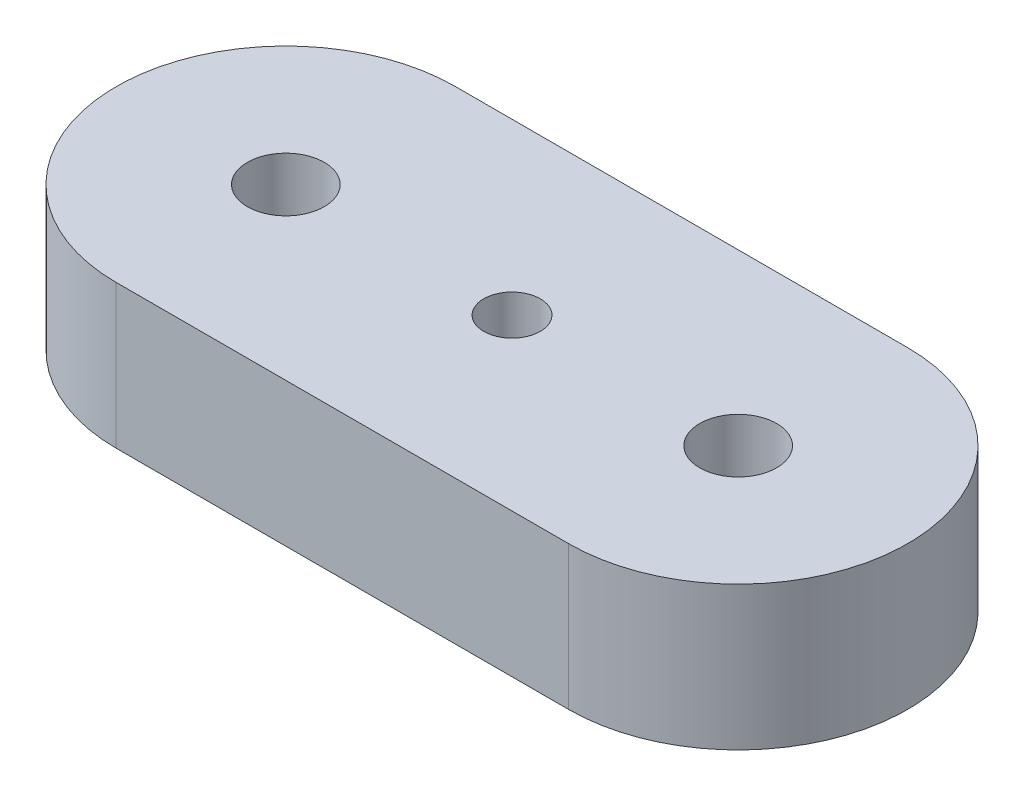
ISO-10303-21;
HEADER;
FILE_DESCRIPTION(('STEP AP214'),'2;1');
FILE_NAME('part.step','',(''),(''),'','','');
FILE_SCHEMA(('AUTOMOTIVE_DESIGN { 1 0 10303 214 1 1 1 1 }'));
ENDSEC;
DATA;
#1=APPLICATION_CONTEXT('core data for automotive mechanical design processes');
#2=APPLICATION_PROTOCOL_DEFINITION('international standard','automotive_design',2000,#1);
#3=PRODUCT_CONTEXT('',#1,'mechanical');
#4=PRODUCT('Part','Part','',(#3));
#5=PRODUCT_RELATED_PRODUCT_CATEGORY('part','',(#4));
#6=PRODUCT_DEFINITION_FORMATION('','',#4);
#7=PRODUCT_DEFINITION_CONTEXT('part definition',#1,'design');
#8=PRODUCT_DEFINITION('design','',#6,#7);
#9=PRODUCT_DEFINITION_SHAPE('','',#8);
#10=(LENGTH_UNIT() NAMED_UNIT(*) SI_UNIT(.MILLI.,.METRE.));
#11=(NAMED_UNIT(*) PLANE_ANGLE_UNIT() SI_UNIT($,.RADIAN.));
#12=(NAMED_UNIT(*) SI_UNIT($,.STERADIAN.) SOLID_ANGLE_UNIT());
#13=UNCERTAINTY_MEASURE_WITH_UNIT(LENGTH_MEASURE(1.E-05),#10,'distance_accuracy_value','');
#14=(GEOMETRIC_REPRESENTATION_CONTEXT(3) GLOBAL_UNCERTAINTY_ASSIGNED_CONTEXT((#13)) GLOBAL_UNIT_ASSIGNED_CONTEXT((#10,
#11,#12)) REPRESENTATION_CONTEXT('',''));
#15=CARTESIAN_POINT('',(0.,0.,0.));
#16=DIRECTION('',(0.,0.,1.));
#17=DIRECTION('',(1.,0.,0.));
#18=AXIS2_PLACEMENT_3D('',#15,#16,#17);
#19=CARTESIAN_POINT('',(0.,6.35,-7.5));
#20=DIRECTION('',(0.,-1.,0.));
#21=DIRECTION('',(0.,0.,-1.));
#22=AXIS2_PLACEMENT_3D('',#19,#20,#21);
#23=CYLINDRICAL_SURFACE('',#22,7.5);
#24=CARTESIAN_POINT('',(0.,0.,-7.5));
#25=DIRECTION('',(0.,1.,0.));
#26=DIRECTION('',(0.,0.,1.));
#27=AXIS2_PLACEMENT_3D('',#24,#25,#26);
#28=CIRCLE('',#27,7.5);
#29=CARTESIAN_POINT('',(0.,0.,-15.));
#30=VERTEX_POINT('',#29);
#31=CARTESIAN_POINT('',(0.,0.,0.));
#32=VERTEX_POINT('',#31);
#33=EDGE_CURVE('E96',#30,#32,#28,.T.);
#34=ORIENTED_EDGE('',*,*,#33,.T.);
#35=DIRECTION('',(0.,-1.,0.));
#36=VECTOR('',#35,1.);
#37=CARTESIAN_POINT('',(0.,6.35,0.));
#38=LINE('',#37,#36);
#39=CARTESIAN_POINT('',(0.,6.35,0.));
#40=VERTEX_POINT('',#39);
#41=EDGE_CURVE('E11',#40,#32,#38,.T.);
#42=ORIENTED_EDGE('',*,*,#41,.F.);
#43=CARTESIAN_POINT('',(0.,6.35,-7.5));
#44=DIRECTION('',(0.,1.,0.));
#45=DIRECTION('',(0.,0.,1.));
#46=AXIS2_PLACEMENT_3D('',#43,#44,#45);
#47=CIRCLE('',#46,7.5);
#48=CARTESIAN_POINT('',(0.,6.35,-15.));
#49=VERTEX_POINT('',#48);
#50=EDGE_CURVE('E84',#49,#40,#47,.T.);
#51=ORIENTED_EDGE('',*,*,#50,.F.);
#52=DIRECTION('',(0.,-1.,0.));
#53=VECTOR('',#52,1.);
#54=CARTESIAN_POINT('',(0.,6.35,-15.));
#55=LINE('',#54,#53);
#56=EDGE_CURVE('E92',#49,#30,#55,.T.);
#57=ORIENTED_EDGE('',*,*,#56,.T.);
#58=EDGE_LOOP('',(#34,#42,#51,#57));
#59=FACE_BOUND('',#58,.T.);
#60=ADVANCED_FACE('F33',(#59),#23,.T.);
#61=CARTESIAN_POINT('',(0.,6.35,0.));
#62=DIRECTION('',(0.,0.,-1.));
#63=DIRECTION('',(-1.,0.,0.));
#64=AXIS2_PLACEMENT_3D('',#61,#62,#63);
#65=PLANE('',#64);
#66=DIRECTION('',(1.,0.,0.));
#67=VECTOR('',#66,1.);
#68=CARTESIAN_POINT('',(0.,0.,0.));
#69=LINE('',#68,#67);
#70=CARTESIAN_POINT('',(20.,0.,0.));
#71=VERTEX_POINT('',#70);
#72=EDGE_CURVE('E88',#32,#71,#69,.T.);
#73=ORIENTED_EDGE('',*,*,#72,.T.);
#74=DIRECTION('',(0.,-1.,0.));
#75=VECTOR('',#74,1.);
#76=CARTESIAN_POINT('',(20.,6.35,0.));
#77=LINE('',#76,#75);
#78=CARTESIAN_POINT('',(20.,6.35,0.));
#79=VERTEX_POINT('',#78);
#80=EDGE_CURVE('E41',#79,#71,#77,.T.);
#81=ORIENTED_EDGE('',*,*,#80,.F.);
#82=DIRECTION('',(1.,0.,0.));
#83=VECTOR('',#82,1.);
#84=CARTESIAN_POINT('',(0.,6.35,0.));
#85=LINE('',#84,#83);
#86=EDGE_CURVE('E79',#40,#79,#85,.T.);
#87=ORIENTED_EDGE('',*,*,#86,.F.);
#88=ORIENTED_EDGE('',*,*,#41,.T.);
#89=EDGE_LOOP('',(#73,#81,#87,#88));
#90=FACE_BOUND('',#89,.T.);
#91=ADVANCED_FACE('F87',(#90),#65,.F.);
#92=CARTESIAN_POINT('',(20.,6.35,-7.5));
#93=DIRECTION('',(0.,-1.,0.));
#94=DIRECTION('',(0.,0.,-1.));
#95=AXIS2_PLACEMENT_3D('',#92,#93,#94);
#96=CYLINDRICAL_SURFACE('',#95,7.5);
#97=CARTESIAN_POINT('',(20.,0.,-7.5));
#98=DIRECTION('',(0.,1.,0.));
#99=DIRECTION('',(0.,0.,-1.));
#100=AXIS2_PLACEMENT_3D('',#97,#98,#99);
#101=CIRCLE('',#100,7.5);
#102=CARTESIAN_POINT('',(20.,0.,-15.));
#103=VERTEX_POINT('',#102);
#104=EDGE_CURVE('E66',#71,#103,#101,.T.);
#105=ORIENTED_EDGE('',*,*,#104,.T.);
#106=DIRECTION('',(0.,-1.,0.));
#107=VECTOR('',#106,1.);
#108=CARTESIAN_POINT('',(20.,6.35,-15.));
#109=LINE('',#108,#107);
#110=CARTESIAN_POINT('',(20.,6.35,-15.));
#111=VERTEX_POINT('',#110);
#112=EDGE_CURVE('E89',#111,#103,#109,.T.);
#113=ORIENTED_EDGE('',*,*,#112,.F.);
#114=CARTESIAN_POINT('',(20.,6.35,-7.5));
#115=DIRECTION('',(0.,1.,0.));
#116=DIRECTION('',(0.,0.,-1.));
#117=AXIS2_PLACEMENT_3D('',#114,#115,#116);
#118=CIRCLE('',#117,7.5);
#119=EDGE_CURVE('E82',#79,#111,#118,.T.);
#120=ORIENTED_EDGE('',*,*,#119,.F.);
#121=ORIENTED_EDGE('',*,*,#80,.T.);
#122=EDGE_LOOP('',(#105,#113,#120,#121));
#123=FACE_BOUND('',#122,.T.);
#124=ADVANCED_FACE('F90',(#123),#96,.T.);
#125=CARTESIAN_POINT('',(0.,6.35,-15.));
#126=DIRECTION('',(0.,0.,1.));
#127=DIRECTION('',(1.,0.,0.));
#128=AXIS2_PLACEMENT_3D('',#125,#126,#127);
#129=PLANE('',#128);
#130=DIRECTION('',(-1.,0.,0.));
#131=VECTOR('',#130,1.);
#132=CARTESIAN_POINT('',(0.,0.,-15.));
#133=LINE('',#132,#131);
#134=EDGE_CURVE('E72',#103,#30,#133,.T.);
#135=ORIENTED_EDGE('',*,*,#134,.T.);
#136=ORIENTED_EDGE('',*,*,#56,.F.);
#137=DIRECTION('',(-1.,0.,0.));
#138=VECTOR('',#137,1.);
#139=CARTESIAN_POINT('',(0.,6.35,-15.));
#140=LINE('',#139,#138);
#141=EDGE_CURVE('E49',#111,#49,#140,.T.);
#142=ORIENTED_EDGE('',*,*,#141,.F.);
#143=ORIENTED_EDGE('',*,*,#112,.T.);
#144=EDGE_LOOP('',(#135,#136,#142,#143));
#145=FACE_BOUND('',#144,.T.);
#146=ADVANCED_FACE('F104',(#145),#129,.F.);
#147=CARTESIAN_POINT('',(0.,6.35,-7.5));
#148=DIRECTION('',(0.,1.,0.));
#149=DIRECTION('',(0.,0.,1.));
#150=AXIS2_PLACEMENT_3D('',#147,#148,#149);
#151=PLANE('',#150);
#152=CARTESIAN_POINT('',(10.,6.35,-7.5));
#153=DIRECTION('',(0.,1.,0.));
#154=DIRECTION('',(0.,0.,1.));
#155=AXIS2_PLACEMENT_3D('',#152,#153,#154);
#156=CIRCLE('',#155,1.24999999999999);
#157=CARTESIAN_POINT('',(10.,6.35,-6.25000000000001));
#158=VERTEX_POINT('',#157);
#159=EDGE_CURVE('E124',#158,#158,#156,.T.);
#160=ORIENTED_EDGE('',*,*,#159,.F.);
#161=EDGE_LOOP('',(#160));
#162=FACE_BOUND('',#161,.T.);
#163=CARTESIAN_POINT('',(0.,6.35,-7.5));
#164=DIRECTION('',(0.,1.,0.));
#165=DIRECTION('',(0.,0.,1.));
#166=AXIS2_PLACEMENT_3D('',#163,#164,#165);
#167=CIRCLE('',#166,1.69999999999999);
#168=CARTESIAN_POINT('',(0.,6.35,-5.80000000000001));
#169=VERTEX_POINT('',#168);
#170=EDGE_CURVE('E118',#169,#169,#167,.T.);
#171=ORIENTED_EDGE('',*,*,#170,.F.);
#172=EDGE_LOOP('',(#171));
#173=FACE_BOUND('',#172,.T.);
#174=CARTESIAN_POINT('',(20.,6.35,-7.5));
#175=DIRECTION('',(0.,1.,0.));
#176=DIRECTION('',(0.,0.,1.));
#177=AXIS2_PLACEMENT_3D('',#174,#175,#176);
#178=CIRCLE('',#177,1.69999999999999);
#179=CARTESIAN_POINT('',(20.,6.35,-5.80000000000001));
#180=VERTEX_POINT('',#179);
#181=EDGE_CURVE('E112',#180,#180,#178,.T.);
#182=ORIENTED_EDGE('',*,*,#181,.F.);
#183=EDGE_LOOP('',(#182));
#184=FACE_BOUND('',#183,.T.);
#185=ORIENTED_EDGE('',*,*,#50,.T.);
#186=ORIENTED_EDGE('',*,*,#86,.T.);
#187=ORIENTED_EDGE('',*,*,#119,.T.);
#188=ORIENTED_EDGE('',*,*,#141,.T.);
#189=EDGE_LOOP('',(#185,#186,#187,#188));
#190=FACE_BOUND('',#189,.T.);
#191=ADVANCED_FACE('F80',(#162,#173,#184,#190),#151,.T.);
#192=CARTESIAN_POINT('',(0.,0.,-7.5));
#193=DIRECTION('',(0.,1.,0.));
#194=DIRECTION('',(0.,0.,1.));
#195=AXIS2_PLACEMENT_3D('',#192,#193,#194);
#196=PLANE('',#195);
#197=CARTESIAN_POINT('',(10.,0.,-7.5));
#198=DIRECTION('',(0.,1.,0.));
#199=DIRECTION('',(0.,0.,1.));
#200=AXIS2_PLACEMENT_3D('',#197,#198,#199);
#201=CIRCLE('',#200,1.24999999999999);
#202=CARTESIAN_POINT('',(10.,0.,-6.25000000000001));
#203=VERTEX_POINT('',#202);
#204=EDGE_CURVE('E121',#203,#203,#201,.T.);
#205=ORIENTED_EDGE('',*,*,#204,.T.);
#206=EDGE_LOOP('',(#205));
#207=FACE_BOUND('',#206,.T.);
#208=CARTESIAN_POINT('',(0.,0.,-7.5));
#209=DIRECTION('',(0.,1.,0.));
#210=DIRECTION('',(0.,0.,1.));
#211=AXIS2_PLACEMENT_3D('',#208,#209,#210);
#212=CIRCLE('',#211,1.69999999999999);
#213=CARTESIAN_POINT('',(0.,0.,-5.80000000000001));
#214=VERTEX_POINT('',#213);
#215=EDGE_CURVE('E115',#214,#214,#212,.T.);
#216=ORIENTED_EDGE('',*,*,#215,.T.);
#217=EDGE_LOOP('',(#216));
#218=FACE_BOUND('',#217,.T.);
#219=CARTESIAN_POINT('',(20.,0.,-7.5));
#220=DIRECTION('',(0.,1.,0.));
#221=DIRECTION('',(0.,0.,1.));
#222=AXIS2_PLACEMENT_3D('',#219,#220,#221);
#223=CIRCLE('',#222,1.69999999999999);
#224=CARTESIAN_POINT('',(20.,0.,-5.80000000000001));
#225=VERTEX_POINT('',#224);
#226=EDGE_CURVE('E99',#225,#225,#223,.T.);
#227=ORIENTED_EDGE('',*,*,#226,.T.);
#228=EDGE_LOOP('',(#227));
#229=FACE_BOUND('',#228,.T.);
#230=ORIENTED_EDGE('',*,*,#33,.F.);
#231=ORIENTED_EDGE('',*,*,#134,.F.);
#232=ORIENTED_EDGE('',*,*,#104,.F.);
#233=ORIENTED_EDGE('',*,*,#72,.F.);
#234=EDGE_LOOP('',(#230,#231,#232,#233));
#235=FACE_BOUND('',#234,.T.);
#236=ADVANCED_FACE('F107',(#207,#218,#229,#235),#196,.F.);
#237=CARTESIAN_POINT('',(20.,6.35,-7.5));
#238=DIRECTION('',(0.,1.,0.));
#239=DIRECTION('',(0.,0.,1.));
#240=AXIS2_PLACEMENT_3D('',#237,#238,#239);
#241=CYLINDRICAL_SURFACE('',#240,1.69999999999999);
#242=ORIENTED_EDGE('',*,*,#226,.F.);
#243=EDGE_LOOP('',(#242));
#244=FACE_BOUND('',#243,.T.);
#245=ORIENTED_EDGE('',*,*,#181,.T.);
#246=EDGE_LOOP('',(#245));
#247=FACE_BOUND('',#246,.T.);
#248=ADVANCED_FACE('F137',(#244,#247),#241,.F.);
#249=CARTESIAN_POINT('',(0.,6.35,-7.5));
#250=DIRECTION('',(0.,1.,0.));
#251=DIRECTION('',(0.,0.,1.));
#252=AXIS2_PLACEMENT_3D('',#249,#250,#251);
#253=CYLINDRICAL_SURFACE('',#252,1.69999999999999);
#254=ORIENTED_EDGE('',*,*,#215,.F.);
#255=EDGE_LOOP('',(#254));
#256=FACE_BOUND('',#255,.T.);
#257=ORIENTED_EDGE('',*,*,#170,.T.);
#258=EDGE_LOOP('',(#257));
#259=FACE_BOUND('',#258,.T.);
#260=ADVANCED_FACE('F139',(#256,#259),#253,.F.);
#261=CARTESIAN_POINT('',(10.,6.35,-7.5));
#262=DIRECTION('',(0.,1.,0.));
#263=DIRECTION('',(0.,0.,1.));
#264=AXIS2_PLACEMENT_3D('',#261,#262,#263);
#265=CYLINDRICAL_SURFACE('',#264,1.24999999999999);
#266=ORIENTED_EDGE('',*,*,#204,.F.);
#267=EDGE_LOOP('',(#266));
#268=FACE_BOUND('',#267,.T.);
#269=ORIENTED_EDGE('',*,*,#159,.T.);
#270=EDGE_LOOP('',(#269));
#271=FACE_BOUND('',#270,.T.);
#272=ADVANCED_FACE('F128',(#268,#271),#265,.F.);
#273=CLOSED_SHELL('',(#60,#91,#124,#146,#191,#236,#248,#260,#272));
#274=MANIFOLD_SOLID_BREP('B2',#273);
#275=ADVANCED_BREP_SHAPE_REPRESENTATION('',(#18,#274),#14);
#276=SHAPE_DEFINITION_REPRESENTATION(#9,#275);
ENDSEC;
END-ISO-10303-21;
